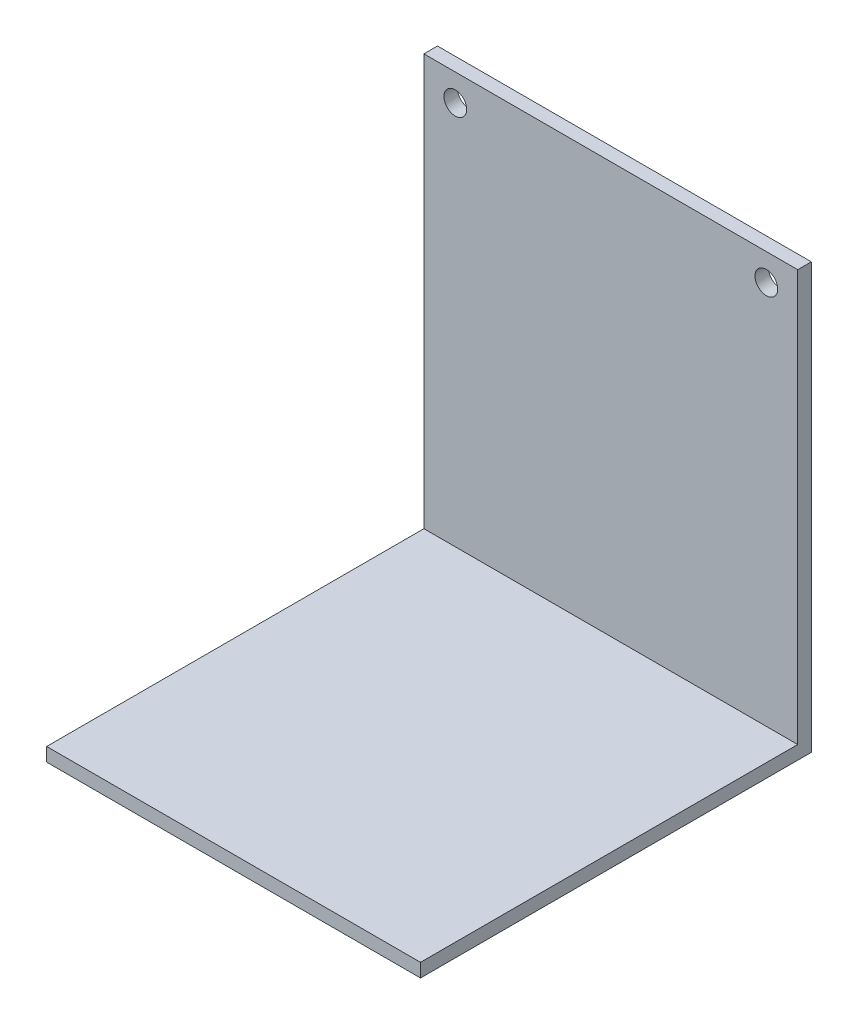
ISO-10303-21;
HEADER;
FILE_DESCRIPTION(('STEP AP214'),'2;1');
FILE_NAME('part.step','',(''),(''),'','','');
FILE_SCHEMA(('AUTOMOTIVE_DESIGN { 1 0 10303 214 1 1 1 1 }'));
ENDSEC;
DATA;
#1=APPLICATION_CONTEXT('core data for automotive mechanical design processes');
#2=APPLICATION_PROTOCOL_DEFINITION('international standard','automotive_design',2000,#1);
#3=PRODUCT_CONTEXT('',#1,'mechanical');
#4=PRODUCT('Part','Part','',(#3));
#5=PRODUCT_RELATED_PRODUCT_CATEGORY('part','',(#4));
#6=PRODUCT_DEFINITION_FORMATION('','',#4);
#7=PRODUCT_DEFINITION_CONTEXT('part definition',#1,'design');
#8=PRODUCT_DEFINITION('design','',#6,#7);
#9=PRODUCT_DEFINITION_SHAPE('','',#8);
#10=(LENGTH_UNIT() NAMED_UNIT(*) SI_UNIT(.MILLI.,.METRE.));
#11=(NAMED_UNIT(*) PLANE_ANGLE_UNIT() SI_UNIT($,.RADIAN.));
#12=(NAMED_UNIT(*) SI_UNIT($,.STERADIAN.) SOLID_ANGLE_UNIT());
#13=UNCERTAINTY_MEASURE_WITH_UNIT(LENGTH_MEASURE(1.E-05),#10,'distance_accuracy_value','');
#14=(GEOMETRIC_REPRESENTATION_CONTEXT(3) GLOBAL_UNCERTAINTY_ASSIGNED_CONTEXT((#13)) GLOBAL_UNIT_ASSIGNED_CONTEXT((#10,
#11,#12)) REPRESENTATION_CONTEXT('',''));
#15=CARTESIAN_POINT('',(0.,0.,0.));
#16=DIRECTION('',(0.,0.,1.));
#17=DIRECTION('',(1.,0.,0.));
#18=AXIS2_PLACEMENT_3D('',#15,#16,#17);
#19=CARTESIAN_POINT('',(-111.677173913043,-83.4472826086957,73.025));
#20=DIRECTION('',(1.,0.,0.));
#21=DIRECTION('',(0.,0.,-1.));
#22=AXIS2_PLACEMENT_3D('',#19,#20,#21);
#23=PLANE('',#22);
#24=DIRECTION('',(0.,0.,-1.));
#25=VECTOR('',#24,1.);
#26=CARTESIAN_POINT('',(-111.677173913043,-80.9072826086957,111.825291197261));
#27=LINE('',#26,#25);
#28=CARTESIAN_POINT('',(-111.677173913043,-80.9072826086957,73.025));
#29=VERTEX_POINT('',#28);
#30=CARTESIAN_POINT('',(-111.677173913043,-80.9072826086957,2.54));
#31=VERTEX_POINT('',#30);
#32=EDGE_CURVE('E49',#29,#31,#27,.T.);
#33=ORIENTED_EDGE('',*,*,#32,.T.);
#34=DIRECTION('',(0.,1.,0.));
#35=VECTOR('',#34,1.);
#36=CARTESIAN_POINT('',(-111.677173913043,-80.9072826086957,2.54));
#37=LINE('',#36,#35);
#38=CARTESIAN_POINT('',(-111.677173913043,-4.07228260869566,2.54));
#39=VERTEX_POINT('',#38);
#40=EDGE_CURVE('E84',#31,#39,#37,.T.);
#41=ORIENTED_EDGE('',*,*,#40,.T.);
#42=DIRECTION('',(0.,0.,-1.));
#43=VECTOR('',#42,1.);
#44=CARTESIAN_POINT('',(-111.677173913043,-4.07228260869566,73.025));
#45=LINE('',#44,#43);
#46=CARTESIAN_POINT('',(-111.677173913043,-4.07228260869566,0.));
#47=VERTEX_POINT('',#46);
#48=EDGE_CURVE('E78',#39,#47,#45,.T.);
#49=ORIENTED_EDGE('',*,*,#48,.T.);
#50=DIRECTION('',(0.,-1.,0.));
#51=VECTOR('',#50,1.);
#52=CARTESIAN_POINT('',(-111.677173913043,-83.4472826086957,0.));
#53=LINE('',#52,#51);
#54=CARTESIAN_POINT('',(-111.677173913043,-83.4472826086957,0.));
#55=VERTEX_POINT('',#54);
#56=EDGE_CURVE('E82',#47,#55,#53,.T.);
#57=ORIENTED_EDGE('',*,*,#56,.T.);
#58=DIRECTION('',(0.,0.,-1.));
#59=VECTOR('',#58,1.);
#60=CARTESIAN_POINT('',(-111.677173913043,-83.4472826086957,73.025));
#61=LINE('',#60,#59);
#62=CARTESIAN_POINT('',(-111.677173913043,-83.4472826086957,73.025));
#63=VERTEX_POINT('',#62);
#64=EDGE_CURVE('E115',#63,#55,#61,.T.);
#65=ORIENTED_EDGE('',*,*,#64,.F.);
#66=DIRECTION('',(0.,-1.,0.));
#67=VECTOR('',#66,1.);
#68=CARTESIAN_POINT('',(-111.677173913043,-83.4472826086957,73.025));
#69=LINE('',#68,#67);
#70=EDGE_CURVE('E96',#29,#63,#69,.T.);
#71=ORIENTED_EDGE('',*,*,#70,.F.);
#72=EDGE_LOOP('',(#33,#41,#49,#57,#65,#71));
#73=FACE_BOUND('',#72,.T.);
#74=ADVANCED_FACE('F33',(#73),#23,.F.);
#75=CARTESIAN_POINT('',(-111.677173913043,-83.4472826086957,73.025));
#76=DIRECTION('',(0.,1.,0.));
#77=DIRECTION('',(0.,0.,1.));
#78=AXIS2_PLACEMENT_3D('',#75,#76,#77);
#79=PLANE('',#78);
#80=DIRECTION('',(1.,0.,0.));
#81=VECTOR('',#80,1.);
#82=CARTESIAN_POINT('',(-111.677173913043,-83.4472826086957,0.));
#83=LINE('',#82,#81);
#84=CARTESIAN_POINT('',(-41.8271739130434,-83.4472826086957,0.));
#85=VERTEX_POINT('',#84);
#86=EDGE_CURVE('E100',#55,#85,#83,.T.);
#87=ORIENTED_EDGE('',*,*,#86,.T.);
#88=DIRECTION('',(0.,0.,-1.));
#89=VECTOR('',#88,1.);
#90=CARTESIAN_POINT('',(-41.8271739130434,-83.4472826086957,73.025));
#91=LINE('',#90,#89);
#92=CARTESIAN_POINT('',(-41.8271739130434,-83.4472826086957,73.025));
#93=VERTEX_POINT('',#92);
#94=EDGE_CURVE('E112',#93,#85,#91,.T.);
#95=ORIENTED_EDGE('',*,*,#94,.F.);
#96=DIRECTION('',(1.,0.,0.));
#97=VECTOR('',#96,1.);
#98=CARTESIAN_POINT('',(-111.677173913043,-83.4472826086957,73.025));
#99=LINE('',#98,#97);
#100=EDGE_CURVE('E58',#63,#93,#99,.T.);
#101=ORIENTED_EDGE('',*,*,#100,.F.);
#102=ORIENTED_EDGE('',*,*,#64,.T.);
#103=EDGE_LOOP('',(#87,#95,#101,#102));
#104=FACE_BOUND('',#103,.T.);
#105=ADVANCED_FACE('F158',(#104),#79,.F.);
#106=CARTESIAN_POINT('',(-41.8271739130434,-83.4472826086957,73.025));
#107=DIRECTION('',(-1.,0.,0.));
#108=DIRECTION('',(0.,0.,1.));
#109=AXIS2_PLACEMENT_3D('',#106,#107,#108);
#110=PLANE('',#109);
#111=DIRECTION('',(0.,0.,-1.));
#112=VECTOR('',#111,1.);
#113=CARTESIAN_POINT('',(-41.8271739130434,-4.07228260869566,73.025));
#114=LINE('',#113,#112);
#115=CARTESIAN_POINT('',(-41.8271739130434,-4.07228260869566,2.54));
#116=VERTEX_POINT('',#115);
#117=CARTESIAN_POINT('',(-41.8271739130434,-4.07228260869566,0.));
#118=VERTEX_POINT('',#117);
#119=EDGE_CURVE('E86',#116,#118,#114,.T.);
#120=ORIENTED_EDGE('',*,*,#119,.F.);
#121=DIRECTION('',(0.,1.,0.));
#122=VECTOR('',#121,1.);
#123=CARTESIAN_POINT('',(-41.8271739130434,-80.9072826086957,2.54));
#124=LINE('',#123,#122);
#125=CARTESIAN_POINT('',(-41.8271739130434,-80.9072826086957,2.54));
#126=VERTEX_POINT('',#125);
#127=EDGE_CURVE('E123',#126,#116,#124,.T.);
#128=ORIENTED_EDGE('',*,*,#127,.F.);
#129=DIRECTION('',(0.,0.,-1.));
#130=VECTOR('',#129,1.);
#131=CARTESIAN_POINT('',(-41.8271739130434,-80.9072826086957,111.825291197261));
#132=LINE('',#131,#130);
#133=CARTESIAN_POINT('',(-41.8271739130434,-80.9072826086957,73.025));
#134=VERTEX_POINT('',#133);
#135=EDGE_CURVE('E133',#134,#126,#132,.T.);
#136=ORIENTED_EDGE('',*,*,#135,.F.);
#137=DIRECTION('',(0.,1.,0.));
#138=VECTOR('',#137,1.);
#139=CARTESIAN_POINT('',(-41.8271739130434,-83.4472826086957,73.025));
#140=LINE('',#139,#138);
#141=EDGE_CURVE('E87',#93,#134,#140,.T.);
#142=ORIENTED_EDGE('',*,*,#141,.F.);
#143=ORIENTED_EDGE('',*,*,#94,.T.);
#144=DIRECTION('',(0.,1.,0.));
#145=VECTOR('',#144,1.);
#146=CARTESIAN_POINT('',(-41.8271739130434,-83.4472826086957,0.));
#147=LINE('',#146,#145);
#148=EDGE_CURVE('E97',#85,#118,#147,.T.);
#149=ORIENTED_EDGE('',*,*,#148,.T.);
#150=EDGE_LOOP('',(#120,#128,#136,#142,#143,#149));
#151=FACE_BOUND('',#150,.T.);
#152=ADVANCED_FACE('F147',(#151),#110,.F.);
#153=CARTESIAN_POINT('',(-111.677173913043,-4.07228260869566,73.025));
#154=DIRECTION('',(0.,-1.,0.));
#155=DIRECTION('',(0.,0.,-1.));
#156=AXIS2_PLACEMENT_3D('',#153,#154,#155);
#157=PLANE('',#156);
#158=ORIENTED_EDGE('',*,*,#48,.F.);
#159=DIRECTION('',(1.,0.,0.));
#160=VECTOR('',#159,1.);
#161=CARTESIAN_POINT('',(-111.677173913043,-4.07228260869566,2.54));
#162=LINE('',#161,#160);
#163=EDGE_CURVE('E11',#39,#116,#162,.T.);
#164=ORIENTED_EDGE('',*,*,#163,.T.);
#165=ORIENTED_EDGE('',*,*,#119,.T.);
#166=DIRECTION('',(-1.,0.,0.));
#167=VECTOR('',#166,1.);
#168=CARTESIAN_POINT('',(-111.677173913043,-4.07228260869566,0.));
#169=LINE('',#168,#167);
#170=EDGE_CURVE('E90',#118,#47,#169,.T.);
#171=ORIENTED_EDGE('',*,*,#170,.T.);
#172=EDGE_LOOP('',(#158,#164,#165,#171));
#173=FACE_BOUND('',#172,.T.);
#174=ADVANCED_FACE('F91',(#173),#157,.F.);
#175=CARTESIAN_POINT('',(0.,0.,73.025));
#176=DIRECTION('',(0.,0.,-1.));
#177=DIRECTION('',(-1.,0.,0.));
#178=AXIS2_PLACEMENT_3D('',#175,#176,#177);
#179=PLANE('',#178);
#180=ORIENTED_EDGE('',*,*,#141,.T.);
#181=DIRECTION('',(-1.,0.,0.));
#182=VECTOR('',#181,1.);
#183=CARTESIAN_POINT('',(0.,-80.9072826086957,73.025));
#184=LINE('',#183,#182);
#185=EDGE_CURVE('E41',#134,#29,#184,.T.);
#186=ORIENTED_EDGE('',*,*,#185,.T.);
#187=ORIENTED_EDGE('',*,*,#70,.T.);
#188=ORIENTED_EDGE('',*,*,#100,.T.);
#189=EDGE_LOOP('',(#180,#186,#187,#188));
#190=FACE_BOUND('',#189,.T.);
#191=ADVANCED_FACE('F141',(#190),#179,.F.);
#192=CARTESIAN_POINT('',(0.,0.,0.));
#193=DIRECTION('',(0.,0.,-1.));
#194=DIRECTION('',(-1.,0.,0.));
#195=AXIS2_PLACEMENT_3D('',#192,#193,#194);
#196=PLANE('',#195);
#197=CARTESIAN_POINT('',(-47.6945739130434,-9.09011677007499,0.));
#198=DIRECTION('',(0.,0.,-1.));
#199=DIRECTION('',(-1.,0.,0.));
#200=AXIS2_PLACEMENT_3D('',#197,#198,#199);
#201=CIRCLE('',#200,2.1238988906678);
#202=CARTESIAN_POINT('',(-49.8184728037112,-9.09011677007499,0.));
#203=VERTEX_POINT('',#202);
#204=EDGE_CURVE('E119',#203,#203,#201,.T.);
#205=ORIENTED_EDGE('',*,*,#204,.F.);
#206=EDGE_LOOP('',(#205));
#207=FACE_BOUND('',#206,.T.);
#208=CARTESIAN_POINT('',(-105.809773913043,-9.09011677007499,0.));
#209=DIRECTION('',(0.,0.,-1.));
#210=DIRECTION('',(-1.,0.,0.));
#211=AXIS2_PLACEMENT_3D('',#208,#209,#210);
#212=CIRCLE('',#211,2.1238988906678);
#213=CARTESIAN_POINT('',(-107.933672803711,-9.09011677007499,0.));
#214=VERTEX_POINT('',#213);
#215=EDGE_CURVE('E125',#214,#214,#212,.T.);
#216=ORIENTED_EDGE('',*,*,#215,.F.);
#217=EDGE_LOOP('',(#216));
#218=FACE_BOUND('',#217,.T.);
#219=ORIENTED_EDGE('',*,*,#56,.F.);
#220=ORIENTED_EDGE('',*,*,#170,.F.);
#221=ORIENTED_EDGE('',*,*,#148,.F.);
#222=ORIENTED_EDGE('',*,*,#86,.F.);
#223=EDGE_LOOP('',(#219,#220,#221,#222));
#224=FACE_BOUND('',#223,.T.);
#225=ADVANCED_FACE('F99',(#207,#218,#224),#196,.T.);
#226=CARTESIAN_POINT('',(-111.677173913043,-80.9072826086957,2.54));
#227=DIRECTION('',(0.,0.,-1.));
#228=DIRECTION('',(-1.,0.,0.));
#229=AXIS2_PLACEMENT_3D('',#226,#227,#228);
#230=PLANE('',#229);
#231=CARTESIAN_POINT('',(-47.6945739130434,-9.09011677007499,2.54));
#232=DIRECTION('',(0.,0.,-1.));
#233=DIRECTION('',(-1.,0.,0.));
#234=AXIS2_PLACEMENT_3D('',#231,#232,#233);
#235=CIRCLE('',#234,2.1238988906678);
#236=CARTESIAN_POINT('',(-49.8184728037112,-9.09011677007499,2.54));
#237=VERTEX_POINT('',#236);
#238=EDGE_CURVE('E36',#237,#237,#235,.T.);
#239=ORIENTED_EDGE('',*,*,#238,.T.);
#240=EDGE_LOOP('',(#239));
#241=FACE_BOUND('',#240,.T.);
#242=CARTESIAN_POINT('',(-105.809773913043,-9.09011677007499,2.54));
#243=DIRECTION('',(0.,0.,-1.));
#244=DIRECTION('',(-1.,0.,0.));
#245=AXIS2_PLACEMENT_3D('',#242,#243,#244);
#246=CIRCLE('',#245,2.1238988906678);
#247=CARTESIAN_POINT('',(-107.933672803711,-9.09011677007499,2.54));
#248=VERTEX_POINT('',#247);
#249=EDGE_CURVE('E117',#248,#248,#246,.T.);
#250=ORIENTED_EDGE('',*,*,#249,.T.);
#251=EDGE_LOOP('',(#250));
#252=FACE_BOUND('',#251,.T.);
#253=ORIENTED_EDGE('',*,*,#40,.F.);
#254=DIRECTION('',(1.,0.,0.));
#255=VECTOR('',#254,1.);
#256=CARTESIAN_POINT('',(-111.677173913043,-80.9072826086957,2.54));
#257=LINE('',#256,#255);
#258=EDGE_CURVE('E102',#31,#126,#257,.T.);
#259=ORIENTED_EDGE('',*,*,#258,.T.);
#260=ORIENTED_EDGE('',*,*,#127,.T.);
#261=ORIENTED_EDGE('',*,*,#163,.F.);
#262=EDGE_LOOP('',(#253,#259,#260,#261));
#263=FACE_BOUND('',#262,.T.);
#264=ADVANCED_FACE('F154',(#241,#252,#263),#230,.F.);
#265=CARTESIAN_POINT('',(-111.677173913043,-80.9072826086957,111.825291197261));
#266=DIRECTION('',(0.,-1.,0.));
#267=DIRECTION('',(0.,0.,-1.));
#268=AXIS2_PLACEMENT_3D('',#265,#266,#267);
#269=PLANE('',#268);
#270=ORIENTED_EDGE('',*,*,#135,.T.);
#271=ORIENTED_EDGE('',*,*,#258,.F.);
#272=ORIENTED_EDGE('',*,*,#32,.F.);
#273=ORIENTED_EDGE('',*,*,#185,.F.);
#274=EDGE_LOOP('',(#270,#271,#272,#273));
#275=FACE_BOUND('',#274,.T.);
#276=ADVANCED_FACE('F150',(#275),#269,.F.);
#277=CARTESIAN_POINT('',(-105.809773913043,-9.09011677007499,73.025));
#278=DIRECTION('',(0.,0.,-1.));
#279=DIRECTION('',(-1.,0.,0.));
#280=AXIS2_PLACEMENT_3D('',#277,#278,#279);
#281=CYLINDRICAL_SURFACE('',#280,2.1238988906678);
#282=ORIENTED_EDGE('',*,*,#215,.T.);
#283=EDGE_LOOP('',(#282));
#284=FACE_BOUND('',#283,.T.);
#285=ORIENTED_EDGE('',*,*,#249,.F.);
#286=EDGE_LOOP('',(#285));
#287=FACE_BOUND('',#286,.T.);
#288=ADVANCED_FACE('F178',(#284,#287),#281,.F.);
#289=CARTESIAN_POINT('',(-47.6945739130434,-9.09011677007499,73.025));
#290=DIRECTION('',(0.,0.,-1.));
#291=DIRECTION('',(-1.,0.,0.));
#292=AXIS2_PLACEMENT_3D('',#289,#290,#291);
#293=CYLINDRICAL_SURFACE('',#292,2.1238988906678);
#294=ORIENTED_EDGE('',*,*,#204,.T.);
#295=EDGE_LOOP('',(#294));
#296=FACE_BOUND('',#295,.T.);
#297=ORIENTED_EDGE('',*,*,#238,.F.);
#298=EDGE_LOOP('',(#297));
#299=FACE_BOUND('',#298,.T.);
#300=ADVANCED_FACE('F181',(#296,#299),#293,.F.);
#301=CLOSED_SHELL('',(#74,#105,#152,#174,#191,#225,#264,#276,#288,#300));
#302=MANIFOLD_SOLID_BREP('B2',#301);
#303=ADVANCED_BREP_SHAPE_REPRESENTATION('',(#18,#302),#14);
#304=SHAPE_DEFINITION_REPRESENTATION(#9,#303);
ENDSEC;
END-ISO-10303-21;
